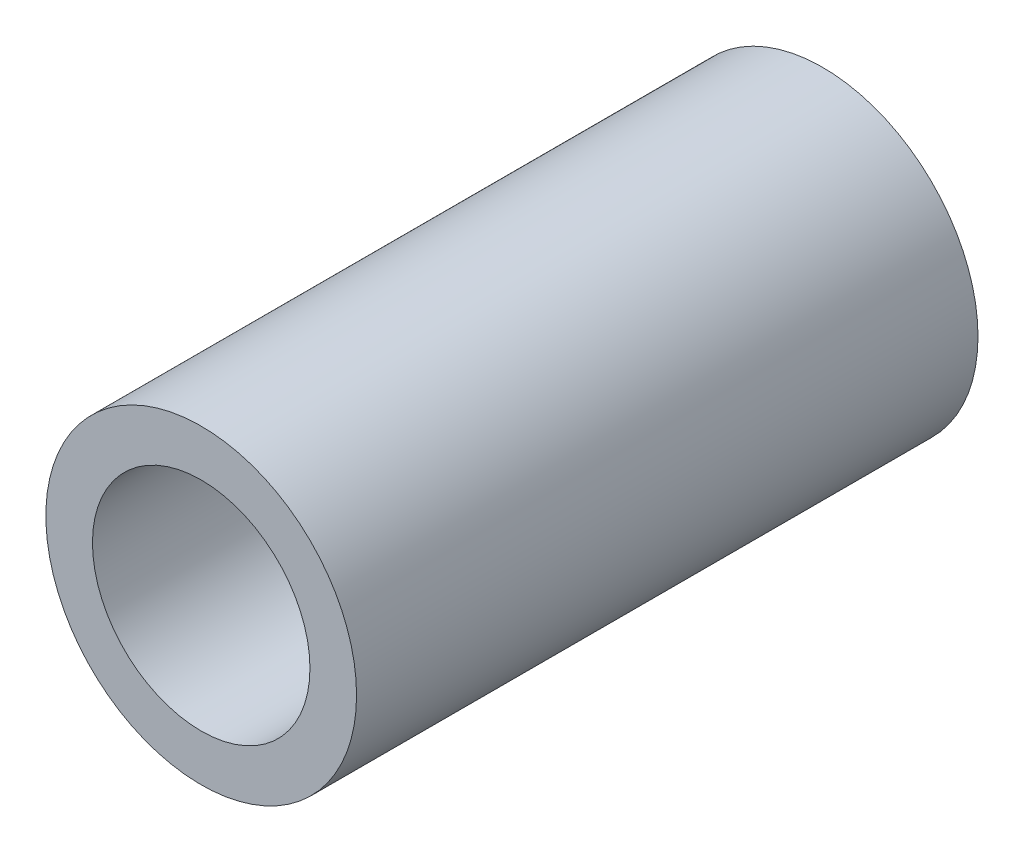
ISO-10303-21;
HEADER;
FILE_DESCRIPTION(('STEP AP214'),'2;1');
FILE_NAME('part.step','',(''),(''),'','','');
FILE_SCHEMA(('AUTOMOTIVE_DESIGN { 1 0 10303 214 1 1 1 1 }'));
ENDSEC;
DATA;
#1=APPLICATION_CONTEXT('core data for automotive mechanical design processes');
#2=APPLICATION_PROTOCOL_DEFINITION('international standard','automotive_design',2000,#1);
#3=PRODUCT_CONTEXT('',#1,'mechanical');
#4=PRODUCT('Part','Part','',(#3));
#5=PRODUCT_RELATED_PRODUCT_CATEGORY('part','',(#4));
#6=PRODUCT_DEFINITION_FORMATION('','',#4);
#7=PRODUCT_DEFINITION_CONTEXT('part definition',#1,'design');
#8=PRODUCT_DEFINITION('design','',#6,#7);
#9=PRODUCT_DEFINITION_SHAPE('','',#8);
#10=(LENGTH_UNIT() NAMED_UNIT(*) SI_UNIT(.MILLI.,.METRE.));
#11=(NAMED_UNIT(*) PLANE_ANGLE_UNIT() SI_UNIT($,.RADIAN.));
#12=(NAMED_UNIT(*) SI_UNIT($,.STERADIAN.) SOLID_ANGLE_UNIT());
#13=UNCERTAINTY_MEASURE_WITH_UNIT(LENGTH_MEASURE(1.E-05),#10,'distance_accuracy_value','');
#14=(GEOMETRIC_REPRESENTATION_CONTEXT(3) GLOBAL_UNCERTAINTY_ASSIGNED_CONTEXT((#13)) GLOBAL_UNIT_ASSIGNED_CONTEXT((#10,
#11,#12)) REPRESENTATION_CONTEXT('',''));
#15=CARTESIAN_POINT('',(0.,0.,0.));
#16=DIRECTION('',(0.,0.,1.));
#17=DIRECTION('',(1.,0.,0.));
#18=AXIS2_PLACEMENT_3D('',#15,#16,#17);
#19=CARTESIAN_POINT('',(0.,0.,8.));
#20=DIRECTION('',(0.,0.,1.));
#21=DIRECTION('',(1.,0.,0.));
#22=AXIS2_PLACEMENT_3D('',#19,#20,#21);
#23=PLANE('',#22);
#24=CARTESIAN_POINT('',(0.,0.,8.));
#25=DIRECTION('',(0.,0.,1.));
#26=DIRECTION('',(1.,0.,0.));
#27=AXIS2_PLACEMENT_3D('',#24,#25,#26);
#28=CIRCLE('',#27,2.);
#29=CARTESIAN_POINT('',(2.,0.,8.));
#30=VERTEX_POINT('',#29);
#31=EDGE_CURVE('E10',#30,#30,#28,.T.);
#32=ORIENTED_EDGE('',*,*,#31,.T.);
#33=EDGE_LOOP('',(#32));
#34=FACE_BOUND('',#33,.T.);
#35=CARTESIAN_POINT('',(0.,0.,8.));
#36=DIRECTION('',(0.,0.,1.));
#37=DIRECTION('',(1.,0.,0.));
#38=AXIS2_PLACEMENT_3D('',#35,#36,#37);
#39=CIRCLE('',#38,1.4);
#40=CARTESIAN_POINT('',(1.4,0.,8.));
#41=VERTEX_POINT('',#40);
#42=EDGE_CURVE('E54',#41,#41,#39,.T.);
#43=ORIENTED_EDGE('',*,*,#42,.F.);
#44=EDGE_LOOP('',(#43));
#45=FACE_BOUND('',#44,.T.);
#46=ADVANCED_FACE('F41',(#34,#45),#23,.T.);
#47=CARTESIAN_POINT('',(0.,0.,0.));
#48=DIRECTION('',(0.,0.,1.));
#49=DIRECTION('',(1.,0.,0.));
#50=AXIS2_PLACEMENT_3D('',#47,#48,#49);
#51=PLANE('',#50);
#52=CARTESIAN_POINT('',(0.,0.,0.));
#53=DIRECTION('',(0.,0.,1.));
#54=DIRECTION('',(1.,0.,0.));
#55=AXIS2_PLACEMENT_3D('',#52,#53,#54);
#56=CIRCLE('',#55,2.);
#57=CARTESIAN_POINT('',(2.,0.,0.));
#58=VERTEX_POINT('',#57);
#59=EDGE_CURVE('E45',#58,#58,#56,.T.);
#60=ORIENTED_EDGE('',*,*,#59,.F.);
#61=EDGE_LOOP('',(#60));
#62=FACE_BOUND('',#61,.T.);
#63=CARTESIAN_POINT('',(0.,0.,0.));
#64=DIRECTION('',(0.,0.,1.));
#65=DIRECTION('',(1.,0.,0.));
#66=AXIS2_PLACEMENT_3D('',#63,#64,#65);
#67=CIRCLE('',#66,1.4);
#68=CARTESIAN_POINT('',(1.4,0.,0.));
#69=VERTEX_POINT('',#68);
#70=EDGE_CURVE('E56',#69,#69,#67,.T.);
#71=ORIENTED_EDGE('',*,*,#70,.T.);
#72=EDGE_LOOP('',(#71));
#73=FACE_BOUND('',#72,.T.);
#74=ADVANCED_FACE('F68',(#62,#73),#51,.F.);
#75=CARTESIAN_POINT('',(0.,0.,8.));
#76=DIRECTION('',(0.,0.,-1.));
#77=DIRECTION('',(-1.,0.,0.));
#78=AXIS2_PLACEMENT_3D('',#75,#76,#77);
#79=CYLINDRICAL_SURFACE('',#78,2.);
#80=ORIENTED_EDGE('',*,*,#31,.F.);
#81=EDGE_LOOP('',(#80));
#82=FACE_BOUND('',#81,.T.);
#83=ORIENTED_EDGE('',*,*,#59,.T.);
#84=EDGE_LOOP('',(#83));
#85=FACE_BOUND('',#84,.T.);
#86=ADVANCED_FACE('F43',(#82,#85),#79,.T.);
#87=CARTESIAN_POINT('',(0.,0.,8.));
#88=DIRECTION('',(0.,0.,-1.));
#89=DIRECTION('',(-1.,0.,0.));
#90=AXIS2_PLACEMENT_3D('',#87,#88,#89);
#91=CYLINDRICAL_SURFACE('',#90,1.4);
#92=ORIENTED_EDGE('',*,*,#42,.T.);
#93=EDGE_LOOP('',(#92));
#94=FACE_BOUND('',#93,.T.);
#95=ORIENTED_EDGE('',*,*,#70,.F.);
#96=EDGE_LOOP('',(#95));
#97=FACE_BOUND('',#96,.T.);
#98=ADVANCED_FACE('F64',(#94,#97),#91,.F.);
#99=CLOSED_SHELL('',(#46,#74,#86,#98));
#100=MANIFOLD_SOLID_BREP('B2',#99);
#101=ADVANCED_BREP_SHAPE_REPRESENTATION('',(#18,#100),#14);
#102=SHAPE_DEFINITION_REPRESENTATION(#9,#101);
ENDSEC;
END-ISO-10303-21;
